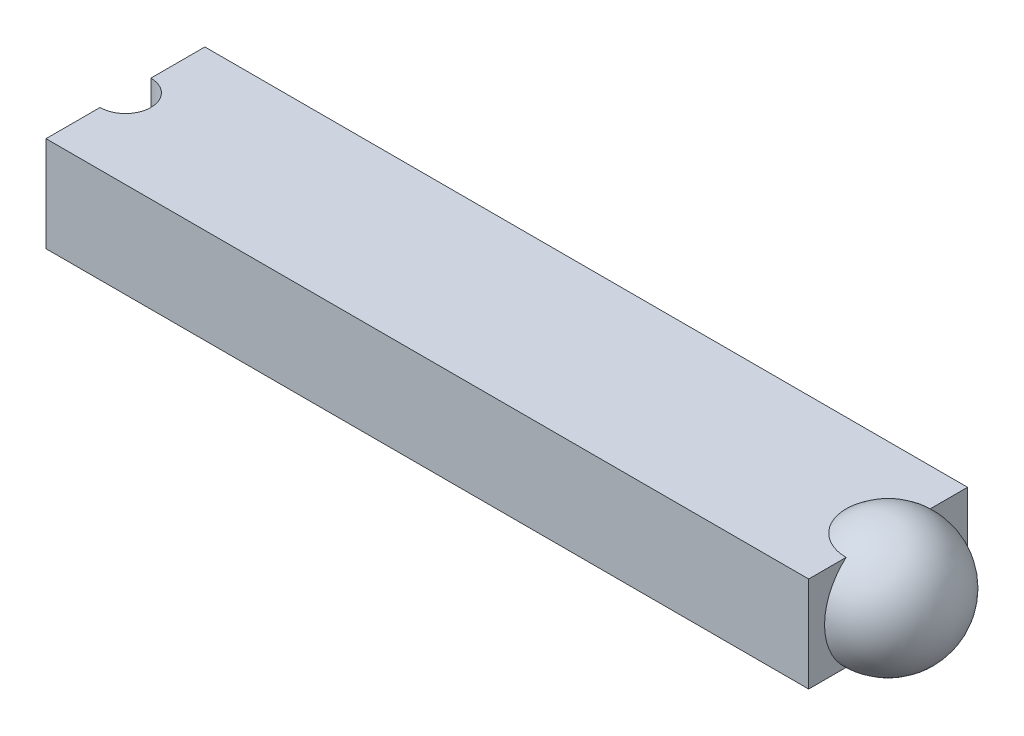
ISO-10303-21;
HEADER;
FILE_DESCRIPTION(('STEP AP214'),'2;1');
FILE_NAME('part.step','',(''),(''),'','','');
FILE_SCHEMA(('AUTOMOTIVE_DESIGN { 1 0 10303 214 1 1 1 1 }'));
ENDSEC;
DATA;
#1=APPLICATION_CONTEXT('core data for automotive mechanical design processes');
#2=APPLICATION_PROTOCOL_DEFINITION('international standard','automotive_design',2000,#1);
#3=PRODUCT_CONTEXT('',#1,'mechanical');
#4=PRODUCT('Part','Part','',(#3));
#5=PRODUCT_RELATED_PRODUCT_CATEGORY('part','',(#4));
#6=PRODUCT_DEFINITION_FORMATION('','',#4);
#7=PRODUCT_DEFINITION_CONTEXT('part definition',#1,'design');
#8=PRODUCT_DEFINITION('design','',#6,#7);
#9=PRODUCT_DEFINITION_SHAPE('','',#8);
#10=(LENGTH_UNIT() NAMED_UNIT(*) SI_UNIT(.MILLI.,.METRE.));
#11=(NAMED_UNIT(*) PLANE_ANGLE_UNIT() SI_UNIT($,.RADIAN.));
#12=(NAMED_UNIT(*) SI_UNIT($,.STERADIAN.) SOLID_ANGLE_UNIT());
#13=UNCERTAINTY_MEASURE_WITH_UNIT(LENGTH_MEASURE(1.E-05),#10,'distance_accuracy_value','');
#14=(GEOMETRIC_REPRESENTATION_CONTEXT(3) GLOBAL_UNCERTAINTY_ASSIGNED_CONTEXT((#13)) GLOBAL_UNIT_ASSIGNED_CONTEXT((#10,
#11,#12)) REPRESENTATION_CONTEXT('',''));
#15=CARTESIAN_POINT('',(0.,0.,0.));
#16=DIRECTION('',(0.,0.,1.));
#17=DIRECTION('',(1.,0.,0.));
#18=AXIS2_PLACEMENT_3D('',#15,#16,#17);
#19=CARTESIAN_POINT('',(120.,0.,0.));
#20=DIRECTION('',(-1.,0.,0.));
#21=DIRECTION('',(0.,0.,1.));
#22=AXIS2_PLACEMENT_3D('',#19,#20,#21);
#23=PLANE('',#22);
#24=DIRECTION('',(0.,0.,1.));
#25=VECTOR('',#24,1.);
#26=CARTESIAN_POINT('',(120.,7.5,12.5));
#27=LINE('',#26,#25);
#28=CARTESIAN_POINT('',(120.,7.5,-12.5));
#29=VERTEX_POINT('',#28);
#30=CARTESIAN_POINT('',(120.,7.5,-6.61437827766148));
#31=VERTEX_POINT('',#30);
#32=EDGE_CURVE('E162',#29,#31,#27,.T.);
#33=ORIENTED_EDGE('',*,*,#32,.T.);
#34=CARTESIAN_POINT('',(120.,0.,0.));
#35=DIRECTION('',(-1.,0.,0.));
#36=DIRECTION('',(0.,0.,1.));
#37=AXIS2_PLACEMENT_3D('',#34,#35,#36);
#38=CIRCLE('',#37,10.);
#39=CARTESIAN_POINT('',(120.,-7.5,-6.61437827766148));
#40=VERTEX_POINT('',#39);
#41=EDGE_CURVE('E11',#31,#40,#38,.T.);
#42=ORIENTED_EDGE('',*,*,#41,.T.);
#43=DIRECTION('',(0.,0.,-1.));
#44=VECTOR('',#43,1.);
#45=CARTESIAN_POINT('',(120.,-7.5,12.5));
#46=LINE('',#45,#44);
#47=CARTESIAN_POINT('',(120.,-7.5,-12.5));
#48=VERTEX_POINT('',#47);
#49=EDGE_CURVE('E113',#40,#48,#46,.T.);
#50=ORIENTED_EDGE('',*,*,#49,.T.);
#51=DIRECTION('',(0.,1.,0.));
#52=VECTOR('',#51,1.);
#53=CARTESIAN_POINT('',(120.,-7.5,-12.5));
#54=LINE('',#53,#52);
#55=EDGE_CURVE('E142',#48,#29,#54,.T.);
#56=ORIENTED_EDGE('',*,*,#55,.T.);
#57=EDGE_LOOP('',(#33,#42,#50,#56));
#58=FACE_BOUND('',#57,.T.);
#59=ADVANCED_FACE('F39',(#58),#23,.F.);
#60=CARTESIAN_POINT('',(0.,0.,0.));
#61=DIRECTION('',(-1.,0.,0.));
#62=DIRECTION('',(0.,0.,1.));
#63=AXIS2_PLACEMENT_3D('',#60,#61,#62);
#64=PLANE('',#63);
#65=DIRECTION('',(0.,0.,-1.));
#66=VECTOR('',#65,1.);
#67=CARTESIAN_POINT('',(0.,-7.5,12.5));
#68=LINE('',#67,#66);
#69=CARTESIAN_POINT('',(0.,-7.5,-4.));
#70=VERTEX_POINT('',#69);
#71=CARTESIAN_POINT('',(0.,-7.5,-12.5));
#72=VERTEX_POINT('',#71);
#73=EDGE_CURVE('E138',#70,#72,#68,.T.);
#74=ORIENTED_EDGE('',*,*,#73,.F.);
#75=DIRECTION('',(0.,-1.,0.));
#76=VECTOR('',#75,1.);
#77=CARTESIAN_POINT('',(0.,12.5,-4.));
#78=LINE('',#77,#76);
#79=CARTESIAN_POINT('',(0.,7.5,-4.));
#80=VERTEX_POINT('',#79);
#81=EDGE_CURVE('E110',#70,#80,#78,.F.);
#82=ORIENTED_EDGE('',*,*,#81,.T.);
#83=DIRECTION('',(0.,0.,1.));
#84=VECTOR('',#83,1.);
#85=CARTESIAN_POINT('',(0.,7.5,12.5));
#86=LINE('',#85,#84);
#87=CARTESIAN_POINT('',(0.,7.5,-12.5));
#88=VERTEX_POINT('',#87);
#89=EDGE_CURVE('E135',#88,#80,#86,.T.);
#90=ORIENTED_EDGE('',*,*,#89,.F.);
#91=DIRECTION('',(0.,1.,0.));
#92=VECTOR('',#91,1.);
#93=CARTESIAN_POINT('',(0.,-7.5,-12.5));
#94=LINE('',#93,#92);
#95=EDGE_CURVE('E129',#72,#88,#94,.T.);
#96=ORIENTED_EDGE('',*,*,#95,.F.);
#97=EDGE_LOOP('',(#74,#82,#90,#96));
#98=FACE_BOUND('',#97,.T.);
#99=ADVANCED_FACE('F154',(#98),#64,.T.);
#100=CARTESIAN_POINT('',(0.,7.5,4.));
#101=VERTEX_POINT('',#100);
#102=CARTESIAN_POINT('',(0.,7.5,12.5));
#103=VERTEX_POINT('',#102);
#104=EDGE_CURVE('E134',#101,#103,#86,.T.);
#105=ORIENTED_EDGE('',*,*,#104,.F.);
#106=DIRECTION('',(0.,-1.,0.));
#107=VECTOR('',#106,1.);
#108=CARTESIAN_POINT('',(0.,12.5,4.));
#109=LINE('',#108,#107);
#110=CARTESIAN_POINT('',(0.,-7.5,4.));
#111=VERTEX_POINT('',#110);
#112=EDGE_CURVE('E151',#101,#111,#109,.T.);
#113=ORIENTED_EDGE('',*,*,#112,.T.);
#114=CARTESIAN_POINT('',(0.,-7.5,12.5));
#115=VERTEX_POINT('',#114);
#116=EDGE_CURVE('E139',#115,#111,#68,.T.);
#117=ORIENTED_EDGE('',*,*,#116,.F.);
#118=DIRECTION('',(0.,-1.,0.));
#119=VECTOR('',#118,1.);
#120=CARTESIAN_POINT('',(0.,-7.5,12.5));
#121=LINE('',#120,#119);
#122=EDGE_CURVE('E140',#103,#115,#121,.T.);
#123=ORIENTED_EDGE('',*,*,#122,.F.);
#124=EDGE_LOOP('',(#105,#113,#117,#123));
#125=FACE_BOUND('',#124,.T.);
#126=ADVANCED_FACE('F178',(#125),#64,.T.);
#127=CARTESIAN_POINT('',(120.,-7.5,-12.5));
#128=DIRECTION('',(0.,0.,1.));
#129=DIRECTION('',(1.,0.,0.));
#130=AXIS2_PLACEMENT_3D('',#127,#128,#129);
#131=PLANE('',#130);
#132=ORIENTED_EDGE('',*,*,#95,.T.);
#133=DIRECTION('',(-1.,0.,0.));
#134=VECTOR('',#133,1.);
#135=CARTESIAN_POINT('',(120.,7.5,-12.5));
#136=LINE('',#135,#134);
#137=EDGE_CURVE('E146',#29,#88,#136,.T.);
#138=ORIENTED_EDGE('',*,*,#137,.F.);
#139=ORIENTED_EDGE('',*,*,#55,.F.);
#140=DIRECTION('',(-1.,0.,0.));
#141=VECTOR('',#140,1.);
#142=CARTESIAN_POINT('',(120.,-7.5,-12.5));
#143=LINE('',#142,#141);
#144=EDGE_CURVE('E121',#48,#72,#143,.T.);
#145=ORIENTED_EDGE('',*,*,#144,.T.);
#146=EDGE_LOOP('',(#132,#138,#139,#145));
#147=FACE_BOUND('',#146,.T.);
#148=ADVANCED_FACE('F41',(#147),#131,.F.);
#149=CARTESIAN_POINT('',(120.,7.5,12.5));
#150=DIRECTION('',(0.,-1.,0.));
#151=DIRECTION('',(0.,0.,-1.));
#152=AXIS2_PLACEMENT_3D('',#149,#150,#151);
#153=PLANE('',#152);
#154=CARTESIAN_POINT('',(120.,7.5,6.61437827766148));
#155=VERTEX_POINT('',#154);
#156=CARTESIAN_POINT('',(120.,7.5,12.5));
#157=VERTEX_POINT('',#156);
#158=EDGE_CURVE('E174',#155,#157,#27,.T.);
#159=ORIENTED_EDGE('',*,*,#158,.F.);
#160=CARTESIAN_POINT('',(120.,7.5,0.));
#161=DIRECTION('',(0.,-1.,0.));
#162=DIRECTION('',(0.,0.,-1.));
#163=AXIS2_PLACEMENT_3D('',#160,#161,#162);
#164=CIRCLE('',#163,6.61437827766148);
#165=EDGE_CURVE('E53',#155,#31,#164,.T.);
#166=ORIENTED_EDGE('',*,*,#165,.T.);
#167=ORIENTED_EDGE('',*,*,#32,.F.);
#168=ORIENTED_EDGE('',*,*,#137,.T.);
#169=ORIENTED_EDGE('',*,*,#89,.T.);
#170=CARTESIAN_POINT('',(0.,7.5,0.));
#171=DIRECTION('',(0.,-1.,0.));
#172=DIRECTION('',(0.,0.,-1.));
#173=AXIS2_PLACEMENT_3D('',#170,#171,#172);
#174=CIRCLE('',#173,4.);
#175=EDGE_CURVE('E132',#101,#80,#174,.F.);
#176=ORIENTED_EDGE('',*,*,#175,.F.);
#177=ORIENTED_EDGE('',*,*,#104,.T.);
#178=DIRECTION('',(-1.,0.,0.));
#179=VECTOR('',#178,1.);
#180=CARTESIAN_POINT('',(120.,7.5,12.5));
#181=LINE('',#180,#179);
#182=EDGE_CURVE('E144',#157,#103,#181,.T.);
#183=ORIENTED_EDGE('',*,*,#182,.F.);
#184=EDGE_LOOP('',(#159,#166,#167,#168,#169,#176,#177,#183));
#185=FACE_BOUND('',#184,.T.);
#186=ADVANCED_FACE('F157',(#185),#153,.F.);
#187=CARTESIAN_POINT('',(120.,-7.5,12.5));
#188=DIRECTION('',(0.,0.,-1.));
#189=DIRECTION('',(-1.,0.,0.));
#190=AXIS2_PLACEMENT_3D('',#187,#188,#189);
#191=PLANE('',#190);
#192=ORIENTED_EDGE('',*,*,#122,.T.);
#193=DIRECTION('',(-1.,0.,0.));
#194=VECTOR('',#193,1.);
#195=CARTESIAN_POINT('',(120.,-7.5,12.5));
#196=LINE('',#195,#194);
#197=CARTESIAN_POINT('',(120.,-7.5,12.5));
#198=VERTEX_POINT('',#197);
#199=EDGE_CURVE('E123',#198,#115,#196,.T.);
#200=ORIENTED_EDGE('',*,*,#199,.F.);
#201=DIRECTION('',(0.,-1.,0.));
#202=VECTOR('',#201,1.);
#203=CARTESIAN_POINT('',(120.,-7.5,12.5));
#204=LINE('',#203,#202);
#205=EDGE_CURVE('E120',#157,#198,#204,.T.);
#206=ORIENTED_EDGE('',*,*,#205,.F.);
#207=ORIENTED_EDGE('',*,*,#182,.T.);
#208=EDGE_LOOP('',(#192,#200,#206,#207));
#209=FACE_BOUND('',#208,.T.);
#210=ADVANCED_FACE('F180',(#209),#191,.F.);
#211=CARTESIAN_POINT('',(120.,-7.5,12.5));
#212=DIRECTION('',(0.,1.,0.));
#213=DIRECTION('',(0.,0.,1.));
#214=AXIS2_PLACEMENT_3D('',#211,#212,#213);
#215=PLANE('',#214);
#216=ORIENTED_EDGE('',*,*,#49,.F.);
#217=CARTESIAN_POINT('',(120.,-7.5,0.));
#218=DIRECTION('',(0.,1.,0.));
#219=DIRECTION('',(0.,0.,1.));
#220=AXIS2_PLACEMENT_3D('',#217,#218,#219);
#221=CIRCLE('',#220,6.61437827766148);
#222=CARTESIAN_POINT('',(120.,-7.5,6.61437827766148));
#223=VERTEX_POINT('',#222);
#224=EDGE_CURVE('E103',#40,#223,#221,.T.);
#225=ORIENTED_EDGE('',*,*,#224,.T.);
#226=EDGE_CURVE('E114',#198,#223,#46,.T.);
#227=ORIENTED_EDGE('',*,*,#226,.F.);
#228=ORIENTED_EDGE('',*,*,#199,.T.);
#229=ORIENTED_EDGE('',*,*,#116,.T.);
#230=CARTESIAN_POINT('',(0.,-7.5,0.));
#231=DIRECTION('',(0.,1.,0.));
#232=DIRECTION('',(0.,0.,1.));
#233=AXIS2_PLACEMENT_3D('',#230,#231,#232);
#234=CIRCLE('',#233,4.);
#235=EDGE_CURVE('E64',#70,#111,#234,.F.);
#236=ORIENTED_EDGE('',*,*,#235,.F.);
#237=ORIENTED_EDGE('',*,*,#73,.T.);
#238=ORIENTED_EDGE('',*,*,#144,.F.);
#239=EDGE_LOOP('',(#216,#225,#227,#228,#229,#236,#237,#238));
#240=FACE_BOUND('',#239,.T.);
#241=ADVANCED_FACE('F112',(#240),#215,.F.);
#242=ORIENTED_EDGE('',*,*,#226,.T.);
#243=EDGE_CURVE('E43',#223,#155,#38,.T.);
#244=ORIENTED_EDGE('',*,*,#243,.T.);
#245=ORIENTED_EDGE('',*,*,#158,.T.);
#246=ORIENTED_EDGE('',*,*,#205,.T.);
#247=EDGE_LOOP('',(#242,#244,#245,#246));
#248=FACE_BOUND('',#247,.T.);
#249=ADVANCED_FACE('F119',(#248),#23,.F.);
#250=CARTESIAN_POINT('',(0.,12.5,0.));
#251=DIRECTION('',(0.,-1.,0.));
#252=DIRECTION('',(0.,0.,-1.));
#253=AXIS2_PLACEMENT_3D('',#250,#251,#252);
#254=CYLINDRICAL_SURFACE('',#253,4.);
#255=ORIENTED_EDGE('',*,*,#235,.T.);
#256=ORIENTED_EDGE('',*,*,#112,.F.);
#257=ORIENTED_EDGE('',*,*,#175,.T.);
#258=ORIENTED_EDGE('',*,*,#81,.F.);
#259=EDGE_LOOP('',(#255,#256,#257,#258));
#260=FACE_BOUND('',#259,.T.);
#261=ADVANCED_FACE('F179',(#260),#254,.F.);
#262=CARTESIAN_POINT('',(120.,0.,0.));
#263=DIRECTION('',(0.,-1.,0.));
#264=DIRECTION('',(-1.,0.,0.));
#265=AXIS2_PLACEMENT_3D('',#262,#263,#264);
#266=SPHERICAL_SURFACE('',#265,10.);
#267=ORIENTED_EDGE('',*,*,#41,.F.);
#268=ORIENTED_EDGE('',*,*,#165,.F.);
#269=ORIENTED_EDGE('',*,*,#243,.F.);
#270=ORIENTED_EDGE('',*,*,#224,.F.);
#271=EDGE_LOOP('',(#267,#268,#269,#270));
#272=FACE_BOUND('',#271,.T.);
#273=ADVANCED_FACE('F105',(#272),#266,.T.);
#274=CLOSED_SHELL('',(#59,#99,#126,#148,#186,#210,#241,#249,#261,#273));
#275=MANIFOLD_SOLID_BREP('B2',#274);
#276=ADVANCED_BREP_SHAPE_REPRESENTATION('',(#18,#275),#14);
#277=SHAPE_DEFINITION_REPRESENTATION(#9,#276);
ENDSEC;
END-ISO-10303-21;
